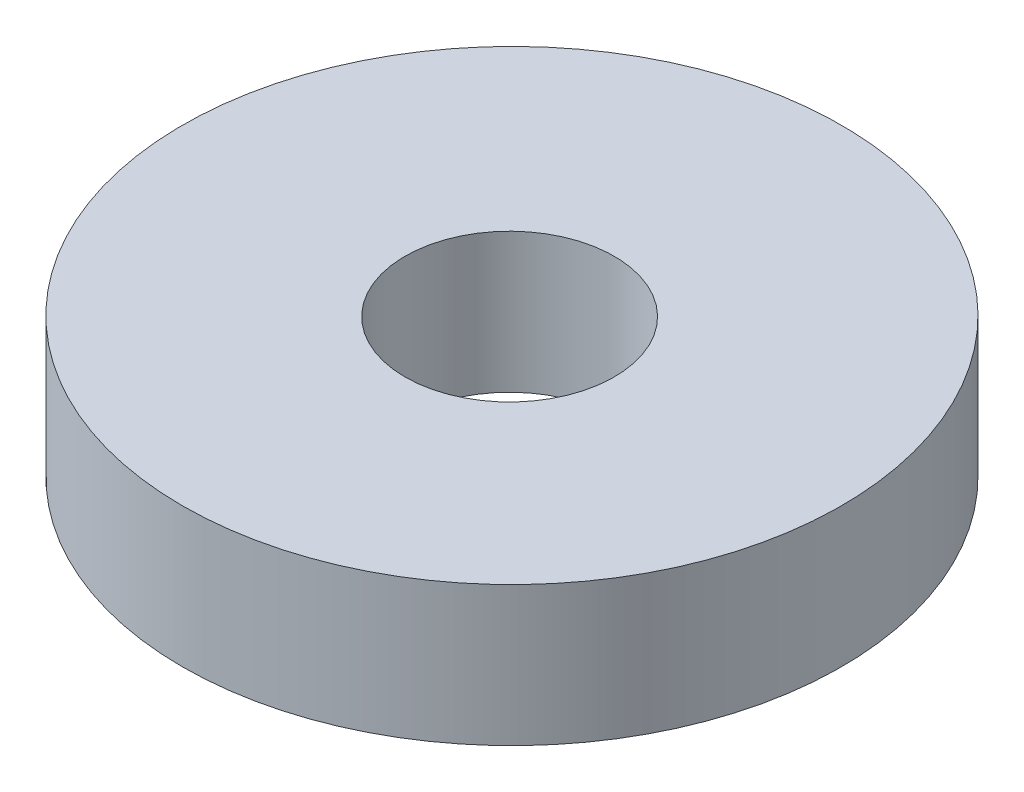
ISO-10303-21;
HEADER;
FILE_DESCRIPTION(('STEP AP214'),'2;1');
FILE_NAME('part.step','',(''),(''),'','','');
FILE_SCHEMA(('AUTOMOTIVE_DESIGN { 1 0 10303 214 1 1 1 1 }'));
ENDSEC;
DATA;
#1=APPLICATION_CONTEXT('core data for automotive mechanical design processes');
#2=APPLICATION_PROTOCOL_DEFINITION('international standard','automotive_design',2000,#1);
#3=PRODUCT_CONTEXT('',#1,'mechanical');
#4=PRODUCT('Part','Part','',(#3));
#5=PRODUCT_RELATED_PRODUCT_CATEGORY('part','',(#4));
#6=PRODUCT_DEFINITION_FORMATION('','',#4);
#7=PRODUCT_DEFINITION_CONTEXT('part definition',#1,'design');
#8=PRODUCT_DEFINITION('design','',#6,#7);
#9=PRODUCT_DEFINITION_SHAPE('','',#8);
#10=(LENGTH_UNIT() NAMED_UNIT(*) SI_UNIT(.MILLI.,.METRE.));
#11=(NAMED_UNIT(*) PLANE_ANGLE_UNIT() SI_UNIT($,.RADIAN.));
#12=(NAMED_UNIT(*) SI_UNIT($,.STERADIAN.) SOLID_ANGLE_UNIT());
#13=UNCERTAINTY_MEASURE_WITH_UNIT(LENGTH_MEASURE(1.E-05),#10,'distance_accuracy_value','');
#14=(GEOMETRIC_REPRESENTATION_CONTEXT(3) GLOBAL_UNCERTAINTY_ASSIGNED_CONTEXT((#13)) GLOBAL_UNIT_ASSIGNED_CONTEXT((#10,
#11,#12)) REPRESENTATION_CONTEXT('',''));
#15=CARTESIAN_POINT('',(0.,0.,0.));
#16=DIRECTION('',(0.,0.,1.));
#17=DIRECTION('',(1.,0.,0.));
#18=AXIS2_PLACEMENT_3D('',#15,#16,#17);
#19=CARTESIAN_POINT('',(0.0298533747943724,10.,-0.303152688066216));
#20=DIRECTION('',(0.,1.,0.));
#21=DIRECTION('',(0.,0.,1.));
#22=AXIS2_PLACEMENT_3D('',#19,#20,#21);
#23=PLANE('',#22);
#24=CARTESIAN_POINT('',(0.0298533747943724,10.,-0.303152688066216));
#25=DIRECTION('',(0.,1.,0.));
#26=DIRECTION('',(0.,0.,1.));
#27=AXIS2_PLACEMENT_3D('',#24,#25,#26);
#28=CIRCLE('',#27,47.25);
#29=CARTESIAN_POINT('',(0.0298533747943724,10.,46.9468473119338));
#30=VERTEX_POINT('',#29);
#31=EDGE_CURVE('E10',#30,#30,#28,.T.);
#32=ORIENTED_EDGE('',*,*,#31,.T.);
#33=EDGE_LOOP('',(#32));
#34=FACE_BOUND('',#33,.T.);
#35=CARTESIAN_POINT('',(0.,10.,0.));
#36=DIRECTION('',(0.,1.,0.));
#37=DIRECTION('',(0.,0.,1.));
#38=AXIS2_PLACEMENT_3D('',#35,#36,#37);
#39=CIRCLE('',#38,15.);
#40=CARTESIAN_POINT('',(0.,10.,15.));
#41=VERTEX_POINT('',#40);
#42=EDGE_CURVE('E45',#41,#41,#39,.T.);
#43=ORIENTED_EDGE('',*,*,#42,.F.);
#44=EDGE_LOOP('',(#43));
#45=FACE_BOUND('',#44,.T.);
#46=ADVANCED_FACE('F34',(#34,#45),#23,.T.);
#47=CARTESIAN_POINT('',(0.0298533747943724,-10.,-0.303152688066216));
#48=DIRECTION('',(0.,1.,0.));
#49=DIRECTION('',(0.,0.,1.));
#50=AXIS2_PLACEMENT_3D('',#47,#48,#49);
#51=PLANE('',#50);
#52=CARTESIAN_POINT('',(0.0298533747943724,-10.,-0.303152688066216));
#53=DIRECTION('',(0.,1.,0.));
#54=DIRECTION('',(0.,0.,1.));
#55=AXIS2_PLACEMENT_3D('',#52,#53,#54);
#56=CIRCLE('',#55,47.25);
#57=CARTESIAN_POINT('',(0.0298533747943724,-10.,46.9468473119338));
#58=VERTEX_POINT('',#57);
#59=EDGE_CURVE('E38',#58,#58,#56,.T.);
#60=ORIENTED_EDGE('',*,*,#59,.F.);
#61=EDGE_LOOP('',(#60));
#62=FACE_BOUND('',#61,.T.);
#63=CARTESIAN_POINT('',(0.,-10.,0.));
#64=DIRECTION('',(0.,1.,0.));
#65=DIRECTION('',(0.,0.,1.));
#66=AXIS2_PLACEMENT_3D('',#63,#64,#65);
#67=CIRCLE('',#66,15.);
#68=CARTESIAN_POINT('',(0.,-10.,15.));
#69=VERTEX_POINT('',#68);
#70=EDGE_CURVE('E47',#69,#69,#67,.T.);
#71=ORIENTED_EDGE('',*,*,#70,.T.);
#72=EDGE_LOOP('',(#71));
#73=FACE_BOUND('',#72,.T.);
#74=ADVANCED_FACE('F57',(#62,#73),#51,.F.);
#75=CARTESIAN_POINT('',(0.0298533747943724,10.,-0.303152688066216));
#76=DIRECTION('',(0.,-1.,0.));
#77=DIRECTION('',(0.,0.,-1.));
#78=AXIS2_PLACEMENT_3D('',#75,#76,#77);
#79=CYLINDRICAL_SURFACE('',#78,47.25);
#80=ORIENTED_EDGE('',*,*,#31,.F.);
#81=EDGE_LOOP('',(#80));
#82=FACE_BOUND('',#81,.T.);
#83=ORIENTED_EDGE('',*,*,#59,.T.);
#84=EDGE_LOOP('',(#83));
#85=FACE_BOUND('',#84,.T.);
#86=ADVANCED_FACE('F36',(#82,#85),#79,.T.);
#87=CARTESIAN_POINT('',(0.,10.,0.));
#88=DIRECTION('',(0.,-1.,0.));
#89=DIRECTION('',(0.,0.,-1.));
#90=AXIS2_PLACEMENT_3D('',#87,#88,#89);
#91=CYLINDRICAL_SURFACE('',#90,15.);
#92=ORIENTED_EDGE('',*,*,#42,.T.);
#93=EDGE_LOOP('',(#92));
#94=FACE_BOUND('',#93,.T.);
#95=ORIENTED_EDGE('',*,*,#70,.F.);
#96=EDGE_LOOP('',(#95));
#97=FACE_BOUND('',#96,.T.);
#98=ADVANCED_FACE('F53',(#94,#97),#91,.F.);
#99=CLOSED_SHELL('',(#46,#74,#86,#98));
#100=MANIFOLD_SOLID_BREP('B2',#99);
#101=ADVANCED_BREP_SHAPE_REPRESENTATION('',(#18,#100),#14);
#102=SHAPE_DEFINITION_REPRESENTATION(#9,#101);
ENDSEC;
END-ISO-10303-21;
